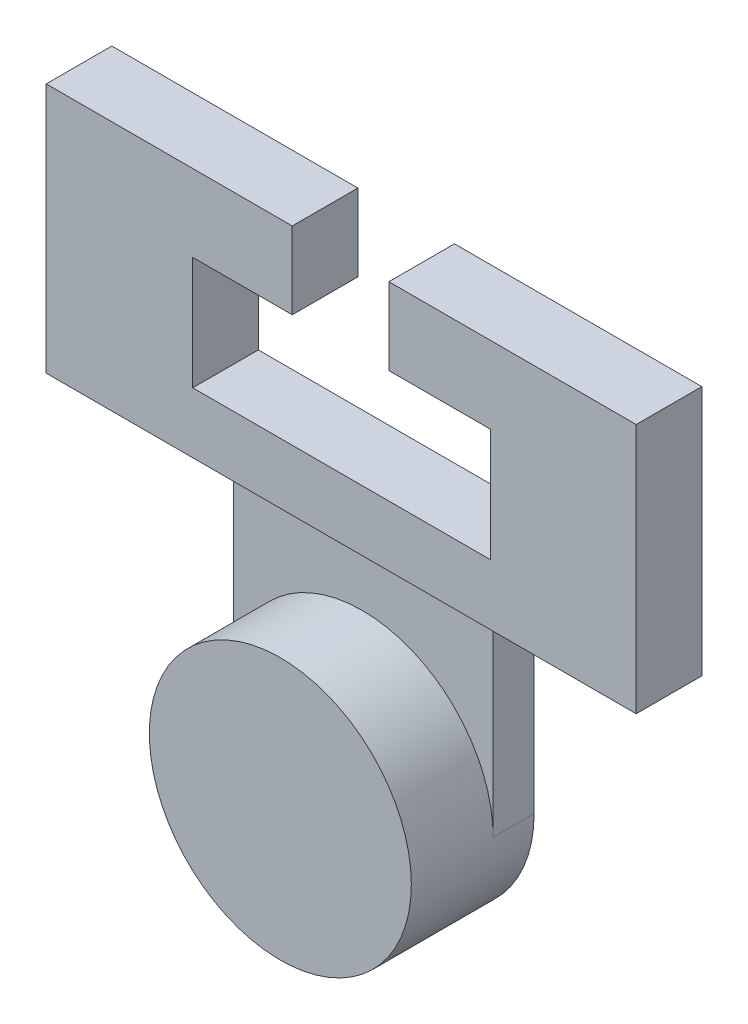
ISO-10303-21;
HEADER;
FILE_DESCRIPTION(('STEP AP214'),'2;1');
FILE_NAME('part.step','',(''),(''),'','','');
FILE_SCHEMA(('AUTOMOTIVE_DESIGN { 1 0 10303 214 1 1 1 1 }'));
ENDSEC;
DATA;
#1=APPLICATION_CONTEXT('core data for automotive mechanical design processes');
#2=APPLICATION_PROTOCOL_DEFINITION('international standard','automotive_design',2000,#1);
#3=PRODUCT_CONTEXT('',#1,'mechanical');
#4=PRODUCT('Part','Part','',(#3));
#5=PRODUCT_RELATED_PRODUCT_CATEGORY('part','',(#4));
#6=PRODUCT_DEFINITION_FORMATION('','',#4);
#7=PRODUCT_DEFINITION_CONTEXT('part definition',#1,'design');
#8=PRODUCT_DEFINITION('design','',#6,#7);
#9=PRODUCT_DEFINITION_SHAPE('','',#8);
#10=(LENGTH_UNIT() NAMED_UNIT(*) SI_UNIT(.MILLI.,.METRE.));
#11=(NAMED_UNIT(*) PLANE_ANGLE_UNIT() SI_UNIT($,.RADIAN.));
#12=(NAMED_UNIT(*) SI_UNIT($,.STERADIAN.) SOLID_ANGLE_UNIT());
#13=UNCERTAINTY_MEASURE_WITH_UNIT(LENGTH_MEASURE(1.E-05),#10,'distance_accuracy_value','');
#14=(GEOMETRIC_REPRESENTATION_CONTEXT(3) GLOBAL_UNCERTAINTY_ASSIGNED_CONTEXT((#13)) GLOBAL_UNIT_ASSIGNED_CONTEXT((#10,
#11,#12)) REPRESENTATION_CONTEXT('',''));
#15=CARTESIAN_POINT('',(0.,0.,0.));
#16=DIRECTION('',(0.,0.,1.));
#17=DIRECTION('',(1.,0.,0.));
#18=AXIS2_PLACEMENT_3D('',#15,#16,#17);
#19=CARTESIAN_POINT('',(0.,0.,-9.525));
#20=DIRECTION('',(0.,0.,1.));
#21=DIRECTION('',(1.,0.,0.));
#22=AXIS2_PLACEMENT_3D('',#19,#20,#21);
#23=CYLINDRICAL_SURFACE('',#22,10.16);
#24=DIRECTION('',(0.,0.,1.));
#25=VECTOR('',#24,1.);
#26=CARTESIAN_POINT('',(-9.99152441464391,1.84256339689434,-9.525));
#27=LINE('',#26,#25);
#28=CARTESIAN_POINT('',(-9.99152441464391,1.84256339689432,-9.525));
#29=VERTEX_POINT('',#28);
#30=CARTESIAN_POINT('',(-9.99152441464391,1.84256339689432,-6.35));
#31=VERTEX_POINT('',#30);
#32=EDGE_CURVE('E268',#29,#31,#27,.T.);
#33=ORIENTED_EDGE('',*,*,#32,.F.);
#34=CARTESIAN_POINT('',(0.,0.,-9.525));
#35=DIRECTION('',(0.,0.,1.));
#36=DIRECTION('',(1.,0.,0.));
#37=AXIS2_PLACEMENT_3D('',#34,#35,#36);
#38=CIRCLE('',#37,10.16);
#39=CARTESIAN_POINT('',(10.16,0.,-9.525));
#40=VERTEX_POINT('',#39);
#41=EDGE_CURVE('E59',#29,#40,#38,.T.);
#42=ORIENTED_EDGE('',*,*,#41,.T.);
#43=DIRECTION('',(0.,0.,-1.));
#44=VECTOR('',#43,1.);
#45=CARTESIAN_POINT('',(10.16,0.,-6.35));
#46=LINE('',#45,#44);
#47=CARTESIAN_POINT('',(10.16,0.,-6.35));
#48=VERTEX_POINT('',#47);
#49=EDGE_CURVE('E258',#48,#40,#46,.T.);
#50=ORIENTED_EDGE('',*,*,#49,.F.);
#51=CARTESIAN_POINT('',(0.,0.,-6.35));
#52=DIRECTION('',(0.,0.,1.));
#53=DIRECTION('',(1.,0.,0.));
#54=AXIS2_PLACEMENT_3D('',#51,#52,#53);
#55=CIRCLE('',#54,10.16);
#56=EDGE_CURVE('E12',#31,#48,#55,.F.);
#57=ORIENTED_EDGE('',*,*,#56,.F.);
#58=EDGE_LOOP('',(#33,#42,#50,#57));
#59=FACE_BOUND('',#58,.T.);
#60=CARTESIAN_POINT('',(0.,0.,0.));
#61=DIRECTION('',(0.,0.,1.));
#62=DIRECTION('',(1.,0.,0.));
#63=AXIS2_PLACEMENT_3D('',#60,#61,#62);
#64=CIRCLE('',#63,10.16);
#65=CARTESIAN_POINT('',(10.16,0.,0.));
#66=VERTEX_POINT('',#65);
#67=EDGE_CURVE('E276',#66,#66,#64,.T.);
#68=ORIENTED_EDGE('',*,*,#67,.F.);
#69=EDGE_LOOP('',(#68));
#70=FACE_BOUND('',#69,.T.);
#71=ADVANCED_FACE('F49',(#59,#70),#23,.T.);
#72=CARTESIAN_POINT('',(0.,0.,-9.525));
#73=DIRECTION('',(0.,0.,1.));
#74=DIRECTION('',(1.,0.,0.));
#75=AXIS2_PLACEMENT_3D('',#72,#73,#74);
#76=PLANE('',#75);
#77=ORIENTED_EDGE('',*,*,#41,.F.);
#78=DIRECTION('',(0.,1.,0.));
#79=VECTOR('',#78,1.);
#80=CARTESIAN_POINT('',(-9.99152441464391,0.,-9.525));
#81=LINE('',#80,#79);
#82=CARTESIAN_POINT('',(-9.99152441464391,15.7544963007669,-9.525));
#83=VERTEX_POINT('',#82);
#84=EDGE_CURVE('E261',#29,#83,#81,.T.);
#85=ORIENTED_EDGE('',*,*,#84,.T.);
#86=DIRECTION('',(-1.,0.,0.));
#87=VECTOR('',#86,1.);
#88=CARTESIAN_POINT('',(-9.99152441464391,15.7544963007669,-9.525));
#89=LINE('',#88,#87);
#90=CARTESIAN_POINT('',(-22.5940298544979,15.7544963007669,-9.525));
#91=VERTEX_POINT('',#90);
#92=EDGE_CURVE('E309',#83,#91,#89,.T.);
#93=ORIENTED_EDGE('',*,*,#92,.T.);
#94=DIRECTION('',(0.,-1.,0.));
#95=VECTOR('',#94,1.);
#96=CARTESIAN_POINT('',(-22.5940298544979,20.4534963007669,-9.525));
#97=LINE('',#96,#95);
#98=CARTESIAN_POINT('',(-22.5940298544979,35.1854963007669,-9.525));
#99=VERTEX_POINT('',#98);
#100=EDGE_CURVE('E172',#99,#91,#97,.T.);
#101=ORIENTED_EDGE('',*,*,#100,.F.);
#102=DIRECTION('',(-1.,0.,0.));
#103=VECTOR('',#102,1.);
#104=CARTESIAN_POINT('',(-22.5940298544979,35.1854963007669,-9.525));
#105=LINE('',#104,#103);
#106=CARTESIAN_POINT('',(-3.51021879319782,35.1854963007669,-9.525));
#107=VERTEX_POINT('',#106);
#108=EDGE_CURVE('E188',#107,#99,#105,.T.);
#109=ORIENTED_EDGE('',*,*,#108,.F.);
#110=DIRECTION('',(0.,-1.,0.));
#111=VECTOR('',#110,1.);
#112=CARTESIAN_POINT('',(-3.51021879319782,35.1854963007669,-9.525));
#113=LINE('',#112,#111);
#114=CARTESIAN_POINT('',(-3.51021879319782,29.2164963007669,-9.525));
#115=VERTEX_POINT('',#114);
#116=EDGE_CURVE('E205',#107,#115,#113,.T.);
#117=ORIENTED_EDGE('',*,*,#116,.T.);
#118=DIRECTION('',(-1.,0.,0.));
#119=VECTOR('',#118,1.);
#120=CARTESIAN_POINT('',(-22.5940298544979,29.2164963007669,-9.525));
#121=LINE('',#120,#119);
#122=CARTESIAN_POINT('',(-11.2292856636925,29.2164963007669,-9.525));
#123=VERTEX_POINT('',#122);
#124=EDGE_CURVE('E192',#115,#123,#121,.T.);
#125=ORIENTED_EDGE('',*,*,#124,.T.);
#126=DIRECTION('',(0.,-1.,0.));
#127=VECTOR('',#126,1.);
#128=CARTESIAN_POINT('',(-11.2292856636925,29.2164963007669,-9.525));
#129=LINE('',#128,#127);
#130=CARTESIAN_POINT('',(-11.2292856636925,20.4534963007669,-9.525));
#131=VERTEX_POINT('',#130);
#132=EDGE_CURVE('E338',#123,#131,#129,.T.);
#133=ORIENTED_EDGE('',*,*,#132,.T.);
#134=DIRECTION('',(-1.,0.,0.));
#135=VECTOR('',#134,1.);
#136=CARTESIAN_POINT('',(23.1661170587528,20.4534963007669,-9.525));
#137=LINE('',#136,#135);
#138=CARTESIAN_POINT('',(11.8519896998851,20.4534963007669,-9.525));
#139=VERTEX_POINT('',#138);
#140=EDGE_CURVE('E299',#139,#131,#137,.T.);
#141=ORIENTED_EDGE('',*,*,#140,.F.);
#142=DIRECTION('',(0.,-1.,0.));
#143=VECTOR('',#142,1.);
#144=CARTESIAN_POINT('',(11.8519896998851,29.2164963007669,-9.525));
#145=LINE('',#144,#143);
#146=CARTESIAN_POINT('',(11.8519896998851,29.2164963007669,-9.525));
#147=VERTEX_POINT('',#146);
#148=EDGE_CURVE('E212',#147,#139,#145,.T.);
#149=ORIENTED_EDGE('',*,*,#148,.F.);
#150=DIRECTION('',(-1.,0.,0.));
#151=VECTOR('',#150,1.);
#152=CARTESIAN_POINT('',(23.1661170587528,29.2164963007669,-9.525));
#153=LINE('',#152,#151);
#154=CARTESIAN_POINT('',(3.98107233357738,29.2164963007669,-9.525));
#155=VERTEX_POINT('',#154);
#156=EDGE_CURVE('E206',#147,#155,#153,.T.);
#157=ORIENTED_EDGE('',*,*,#156,.T.);
#158=DIRECTION('',(0.,-1.,0.));
#159=VECTOR('',#158,1.);
#160=CARTESIAN_POINT('',(3.98107233357738,35.1854963007669,-9.525));
#161=LINE('',#160,#159);
#162=CARTESIAN_POINT('',(3.98107233357738,35.1854963007669,-9.525));
#163=VERTEX_POINT('',#162);
#164=EDGE_CURVE('E214',#163,#155,#161,.T.);
#165=ORIENTED_EDGE('',*,*,#164,.F.);
#166=DIRECTION('',(-1.,0.,0.));
#167=VECTOR('',#166,1.);
#168=CARTESIAN_POINT('',(23.1661170587528,35.1854963007669,-9.525));
#169=LINE('',#168,#167);
#170=CARTESIAN_POINT('',(23.1661170587528,35.1854963007669,-9.525));
#171=VERTEX_POINT('',#170);
#172=EDGE_CURVE('E354',#171,#163,#169,.T.);
#173=ORIENTED_EDGE('',*,*,#172,.F.);
#174=DIRECTION('',(0.,-1.,0.));
#175=VECTOR('',#174,1.);
#176=CARTESIAN_POINT('',(23.1661170587528,20.4534963007669,-9.525));
#177=LINE('',#176,#175);
#178=CARTESIAN_POINT('',(23.1661170587528,15.7544963007669,-9.525));
#179=VERTEX_POINT('',#178);
#180=EDGE_CURVE('E296',#171,#179,#177,.T.);
#181=ORIENTED_EDGE('',*,*,#180,.T.);
#182=CARTESIAN_POINT('',(10.16,15.7544963007669,-9.525));
#183=VERTEX_POINT('',#182);
#184=EDGE_CURVE('E311',#179,#183,#89,.T.);
#185=ORIENTED_EDGE('',*,*,#184,.T.);
#186=DIRECTION('',(0.,-1.,0.));
#187=VECTOR('',#186,1.);
#188=CARTESIAN_POINT('',(10.16,0.,-9.525));
#189=LINE('',#188,#187);
#190=EDGE_CURVE('E260',#183,#40,#189,.T.);
#191=ORIENTED_EDGE('',*,*,#190,.T.);
#192=EDGE_LOOP('',(#77,#85,#93,#101,#109,#117,#125,#133,#141,#149,#157,#165,#173,#181,#185,#191));
#193=FACE_BOUND('',#192,.T.);
#194=ADVANCED_FACE('F382',(#193),#76,.F.);
#195=CARTESIAN_POINT('',(0.,0.,0.));
#196=DIRECTION('',(0.,0.,1.));
#197=DIRECTION('',(1.,0.,0.));
#198=AXIS2_PLACEMENT_3D('',#195,#196,#197);
#199=PLANE('',#198);
#200=ORIENTED_EDGE('',*,*,#67,.T.);
#201=EDGE_LOOP('',(#200));
#202=FACE_BOUND('',#201,.T.);
#203=ADVANCED_FACE('F384',(#202),#199,.T.);
#204=CARTESIAN_POINT('',(10.16,0.,-6.35));
#205=DIRECTION('',(1.,0.,0.));
#206=DIRECTION('',(0.,0.,-1.));
#207=AXIS2_PLACEMENT_3D('',#204,#205,#206);
#208=PLANE('',#207);
#209=ORIENTED_EDGE('',*,*,#190,.F.);
#210=DIRECTION('',(0.,0.,-1.));
#211=VECTOR('',#210,1.);
#212=CARTESIAN_POINT('',(10.16,15.7544963007669,-6.35));
#213=LINE('',#212,#211);
#214=CARTESIAN_POINT('',(10.16,15.7544963007669,-6.35));
#215=VERTEX_POINT('',#214);
#216=EDGE_CURVE('E262',#215,#183,#213,.T.);
#217=ORIENTED_EDGE('',*,*,#216,.F.);
#218=DIRECTION('',(0.,-1.,0.));
#219=VECTOR('',#218,1.);
#220=CARTESIAN_POINT('',(10.16,0.,-6.35));
#221=LINE('',#220,#219);
#222=EDGE_CURVE('E246',#215,#48,#221,.T.);
#223=ORIENTED_EDGE('',*,*,#222,.T.);
#224=ORIENTED_EDGE('',*,*,#49,.T.);
#225=EDGE_LOOP('',(#209,#217,#223,#224));
#226=FACE_BOUND('',#225,.T.);
#227=ADVANCED_FACE('F375',(#226),#208,.T.);
#228=CARTESIAN_POINT('',(-9.99152441464391,0.,-6.35));
#229=DIRECTION('',(-1.,0.,0.));
#230=DIRECTION('',(0.,0.,1.));
#231=AXIS2_PLACEMENT_3D('',#228,#229,#230);
#232=PLANE('',#231);
#233=ORIENTED_EDGE('',*,*,#84,.F.);
#234=ORIENTED_EDGE('',*,*,#32,.T.);
#235=DIRECTION('',(0.,1.,0.));
#236=VECTOR('',#235,1.);
#237=CARTESIAN_POINT('',(-9.99152441464391,0.,-6.35));
#238=LINE('',#237,#236);
#239=CARTESIAN_POINT('',(-9.99152441464391,15.7544963007669,-6.35));
#240=VERTEX_POINT('',#239);
#241=EDGE_CURVE('E243',#31,#240,#238,.T.);
#242=ORIENTED_EDGE('',*,*,#241,.T.);
#243=DIRECTION('',(0.,0.,-1.));
#244=VECTOR('',#243,1.);
#245=CARTESIAN_POINT('',(-9.99152441464391,15.7544963007669,-6.35));
#246=LINE('',#245,#244);
#247=EDGE_CURVE('E267',#240,#83,#246,.T.);
#248=ORIENTED_EDGE('',*,*,#247,.T.);
#249=EDGE_LOOP('',(#233,#234,#242,#248));
#250=FACE_BOUND('',#249,.T.);
#251=ADVANCED_FACE('F385',(#250),#232,.T.);
#252=CARTESIAN_POINT('',(0.,0.,-6.35));
#253=DIRECTION('',(0.,0.,1.));
#254=DIRECTION('',(1.,0.,0.));
#255=AXIS2_PLACEMENT_3D('',#252,#253,#254);
#256=PLANE('',#255);
#257=ORIENTED_EDGE('',*,*,#241,.F.);
#258=ORIENTED_EDGE('',*,*,#56,.T.);
#259=ORIENTED_EDGE('',*,*,#222,.F.);
#260=DIRECTION('',(1.,0.,0.));
#261=VECTOR('',#260,1.);
#262=CARTESIAN_POINT('',(10.16,15.7544963007669,-6.35));
#263=LINE('',#262,#261);
#264=EDGE_CURVE('E249',#240,#215,#263,.T.);
#265=ORIENTED_EDGE('',*,*,#264,.F.);
#266=EDGE_LOOP('',(#257,#258,#259,#265));
#267=FACE_BOUND('',#266,.T.);
#268=ADVANCED_FACE('F374',(#267),#256,.T.);
#269=CARTESIAN_POINT('',(-22.5940298544979,20.4534963007669,-9.525));
#270=DIRECTION('',(1.,0.,0.));
#271=DIRECTION('',(0.,0.,-1.));
#272=AXIS2_PLACEMENT_3D('',#269,#270,#271);
#273=PLANE('',#272);
#274=DIRECTION('',(0.,0.,1.));
#275=VECTOR('',#274,1.);
#276=CARTESIAN_POINT('',(-22.5940298544979,15.7544963007669,-9.525));
#277=LINE('',#276,#275);
#278=CARTESIAN_POINT('',(-22.5940298544979,15.7544963007669,-4.4350592362056));
#279=VERTEX_POINT('',#278);
#280=EDGE_CURVE('E166',#91,#279,#277,.T.);
#281=ORIENTED_EDGE('',*,*,#280,.T.);
#282=DIRECTION('',(0.,-1.,0.));
#283=VECTOR('',#282,1.);
#284=CARTESIAN_POINT('',(-22.5940298544979,20.4534963007669,-4.4350592362056));
#285=LINE('',#284,#283);
#286=CARTESIAN_POINT('',(-22.5940298544979,35.1854963007669,-4.4350592362056));
#287=VERTEX_POINT('',#286);
#288=EDGE_CURVE('E165',#287,#279,#285,.T.);
#289=ORIENTED_EDGE('',*,*,#288,.F.);
#290=DIRECTION('',(0.,0.,1.));
#291=VECTOR('',#290,1.);
#292=CARTESIAN_POINT('',(-22.5940298544979,35.1854963007669,-9.525));
#293=LINE('',#292,#291);
#294=EDGE_CURVE('E170',#99,#287,#293,.T.);
#295=ORIENTED_EDGE('',*,*,#294,.F.);
#296=ORIENTED_EDGE('',*,*,#100,.T.);
#297=EDGE_LOOP('',(#281,#289,#295,#296));
#298=FACE_BOUND('',#297,.T.);
#299=ADVANCED_FACE('F163',(#298),#273,.F.);
#300=CARTESIAN_POINT('',(-22.5940298544979,20.4534963007669,-4.4350592362056));
#301=DIRECTION('',(0.,0.,-1.));
#302=DIRECTION('',(-1.,0.,0.));
#303=AXIS2_PLACEMENT_3D('',#300,#301,#302);
#304=PLANE('',#303);
#305=DIRECTION('',(1.,0.,0.));
#306=VECTOR('',#305,1.);
#307=CARTESIAN_POINT('',(-22.5940298544979,15.7544963007669,-4.4350592362056));
#308=LINE('',#307,#306);
#309=CARTESIAN_POINT('',(23.1661170587528,15.7544963007669,-4.4350592362056));
#310=VERTEX_POINT('',#309);
#311=EDGE_CURVE('E286',#279,#310,#308,.T.);
#312=ORIENTED_EDGE('',*,*,#311,.T.);
#313=DIRECTION('',(0.,-1.,0.));
#314=VECTOR('',#313,1.);
#315=CARTESIAN_POINT('',(23.1661170587528,20.4534963007669,-4.4350592362056));
#316=LINE('',#315,#314);
#317=CARTESIAN_POINT('',(23.1661170587528,35.1854963007669,-4.4350592362056));
#318=VERTEX_POINT('',#317);
#319=EDGE_CURVE('E173',#318,#310,#316,.T.);
#320=ORIENTED_EDGE('',*,*,#319,.F.);
#321=DIRECTION('',(1.,0.,0.));
#322=VECTOR('',#321,1.);
#323=CARTESIAN_POINT('',(23.1661170587528,35.1854963007669,-4.4350592362056));
#324=LINE('',#323,#322);
#325=CARTESIAN_POINT('',(3.98107233357738,35.1854963007669,-4.4350592362056));
#326=VERTEX_POINT('',#325);
#327=EDGE_CURVE('E224',#326,#318,#324,.T.);
#328=ORIENTED_EDGE('',*,*,#327,.F.);
#329=DIRECTION('',(0.,-1.,0.));
#330=VECTOR('',#329,1.);
#331=CARTESIAN_POINT('',(3.98107233357738,35.1854963007669,-4.4350592362056));
#332=LINE('',#331,#330);
#333=CARTESIAN_POINT('',(3.98107233357738,29.2164963007669,-4.4350592362056));
#334=VERTEX_POINT('',#333);
#335=EDGE_CURVE('E218',#326,#334,#332,.T.);
#336=ORIENTED_EDGE('',*,*,#335,.T.);
#337=DIRECTION('',(1.,0.,0.));
#338=VECTOR('',#337,1.);
#339=CARTESIAN_POINT('',(23.1661170587528,29.2164963007669,-4.4350592362056));
#340=LINE('',#339,#338);
#341=CARTESIAN_POINT('',(11.8519896998851,29.2164963007669,-4.4350592362056));
#342=VERTEX_POINT('',#341);
#343=EDGE_CURVE('E221',#334,#342,#340,.T.);
#344=ORIENTED_EDGE('',*,*,#343,.T.);
#345=DIRECTION('',(0.,-1.,0.));
#346=VECTOR('',#345,1.);
#347=CARTESIAN_POINT('',(11.8519896998851,29.2164963007669,-4.4350592362056));
#348=LINE('',#347,#346);
#349=CARTESIAN_POINT('',(11.8519896998851,20.4534963007669,-4.4350592362056));
#350=VERTEX_POINT('',#349);
#351=EDGE_CURVE('E330',#342,#350,#348,.T.);
#352=ORIENTED_EDGE('',*,*,#351,.T.);
#353=DIRECTION('',(1.,0.,0.));
#354=VECTOR('',#353,1.);
#355=CARTESIAN_POINT('',(-22.5940298544979,20.4534963007669,-4.4350592362056));
#356=LINE('',#355,#354);
#357=CARTESIAN_POINT('',(-11.2292856636925,20.4534963007669,-4.4350592362056));
#358=VERTEX_POINT('',#357);
#359=EDGE_CURVE('E302',#358,#350,#356,.T.);
#360=ORIENTED_EDGE('',*,*,#359,.F.);
#361=DIRECTION('',(0.,-1.,0.));
#362=VECTOR('',#361,1.);
#363=CARTESIAN_POINT('',(-11.2292856636925,29.2164963007669,-4.4350592362056));
#364=LINE('',#363,#362);
#365=CARTESIAN_POINT('',(-11.2292856636925,29.2164963007669,-4.4350592362056));
#366=VERTEX_POINT('',#365);
#367=EDGE_CURVE('E320',#366,#358,#364,.T.);
#368=ORIENTED_EDGE('',*,*,#367,.F.);
#369=DIRECTION('',(1.,0.,0.));
#370=VECTOR('',#369,1.);
#371=CARTESIAN_POINT('',(-22.5940298544979,29.2164963007669,-4.4350592362056));
#372=LINE('',#371,#370);
#373=CARTESIAN_POINT('',(-3.51021879319782,29.2164963007669,-4.4350592362056));
#374=VERTEX_POINT('',#373);
#375=EDGE_CURVE('E201',#366,#374,#372,.T.);
#376=ORIENTED_EDGE('',*,*,#375,.T.);
#377=DIRECTION('',(0.,-1.,0.));
#378=VECTOR('',#377,1.);
#379=CARTESIAN_POINT('',(-3.51021879319782,35.1854963007669,-4.4350592362056));
#380=LINE('',#379,#378);
#381=CARTESIAN_POINT('',(-3.51021879319782,35.1854963007669,-4.4350592362056));
#382=VERTEX_POINT('',#381);
#383=EDGE_CURVE('E179',#382,#374,#380,.T.);
#384=ORIENTED_EDGE('',*,*,#383,.F.);
#385=DIRECTION('',(1.,0.,0.));
#386=VECTOR('',#385,1.);
#387=CARTESIAN_POINT('',(-22.5940298544979,35.1854963007669,-4.4350592362056));
#388=LINE('',#387,#386);
#389=EDGE_CURVE('E180',#287,#382,#388,.T.);
#390=ORIENTED_EDGE('',*,*,#389,.F.);
#391=ORIENTED_EDGE('',*,*,#288,.T.);
#392=EDGE_LOOP('',(#312,#320,#328,#336,#344,#352,#360,#368,#376,#384,#390,#391));
#393=FACE_BOUND('',#392,.T.);
#394=ADVANCED_FACE('F178',(#393),#304,.F.);
#395=CARTESIAN_POINT('',(23.1661170587528,20.4534963007669,-4.4350592362056));
#396=DIRECTION('',(-1.,0.,0.));
#397=DIRECTION('',(0.,0.,1.));
#398=AXIS2_PLACEMENT_3D('',#395,#396,#397);
#399=PLANE('',#398);
#400=DIRECTION('',(0.,0.,-1.));
#401=VECTOR('',#400,1.);
#402=CARTESIAN_POINT('',(23.1661170587528,15.7544963007669,-4.4350592362056));
#403=LINE('',#402,#401);
#404=EDGE_CURVE('E292',#310,#179,#403,.T.);
#405=ORIENTED_EDGE('',*,*,#404,.T.);
#406=ORIENTED_EDGE('',*,*,#180,.F.);
#407=DIRECTION('',(0.,0.,-1.));
#408=VECTOR('',#407,1.);
#409=CARTESIAN_POINT('',(23.1661170587528,35.1854963007669,-9.525));
#410=LINE('',#409,#408);
#411=EDGE_CURVE('E228',#318,#171,#410,.T.);
#412=ORIENTED_EDGE('',*,*,#411,.F.);
#413=ORIENTED_EDGE('',*,*,#319,.T.);
#414=EDGE_LOOP('',(#405,#406,#412,#413));
#415=FACE_BOUND('',#414,.T.);
#416=ADVANCED_FACE('F370',(#415),#399,.F.);
#417=CARTESIAN_POINT('',(0.,20.4534963007669,0.));
#418=DIRECTION('',(0.,1.,0.));
#419=DIRECTION('',(0.,0.,1.));
#420=AXIS2_PLACEMENT_3D('',#417,#418,#419);
#421=PLANE('',#420);
#422=DIRECTION('',(0.,0.,-1.));
#423=VECTOR('',#422,1.);
#424=CARTESIAN_POINT('',(-11.2292856636925,20.4534963007669,-9.525));
#425=LINE('',#424,#423);
#426=EDGE_CURVE('E64',#358,#131,#425,.T.);
#427=ORIENTED_EDGE('',*,*,#426,.F.);
#428=ORIENTED_EDGE('',*,*,#359,.T.);
#429=DIRECTION('',(0.,0.,1.));
#430=VECTOR('',#429,1.);
#431=CARTESIAN_POINT('',(11.8519896998851,20.4534963007669,-9.525));
#432=LINE('',#431,#430);
#433=EDGE_CURVE('E69',#139,#350,#432,.T.);
#434=ORIENTED_EDGE('',*,*,#433,.F.);
#435=ORIENTED_EDGE('',*,*,#140,.T.);
#436=EDGE_LOOP('',(#427,#428,#434,#435));
#437=FACE_BOUND('',#436,.T.);
#438=ADVANCED_FACE('F409',(#437),#421,.T.);
#439=CARTESIAN_POINT('',(0.,15.7544963007669,0.));
#440=DIRECTION('',(0.,1.,0.));
#441=DIRECTION('',(0.,0.,1.));
#442=AXIS2_PLACEMENT_3D('',#439,#440,#441);
#443=PLANE('',#442);
#444=ORIENTED_EDGE('',*,*,#247,.F.);
#445=ORIENTED_EDGE('',*,*,#264,.T.);
#446=ORIENTED_EDGE('',*,*,#216,.T.);
#447=ORIENTED_EDGE('',*,*,#184,.F.);
#448=ORIENTED_EDGE('',*,*,#404,.F.);
#449=ORIENTED_EDGE('',*,*,#311,.F.);
#450=ORIENTED_EDGE('',*,*,#280,.F.);
#451=ORIENTED_EDGE('',*,*,#92,.F.);
#452=EDGE_LOOP('',(#444,#445,#446,#447,#448,#449,#450,#451));
#453=FACE_BOUND('',#452,.T.);
#454=ADVANCED_FACE('F310',(#453),#443,.F.);
#455=CARTESIAN_POINT('',(11.8519896998851,29.2164963007669,-9.525));
#456=DIRECTION('',(1.,0.,0.));
#457=DIRECTION('',(0.,0.,-1.));
#458=AXIS2_PLACEMENT_3D('',#455,#456,#457);
#459=PLANE('',#458);
#460=ORIENTED_EDGE('',*,*,#433,.T.);
#461=ORIENTED_EDGE('',*,*,#351,.F.);
#462=DIRECTION('',(0.,0.,1.));
#463=VECTOR('',#462,1.);
#464=CARTESIAN_POINT('',(11.8519896998851,29.2164963007669,-9.525));
#465=LINE('',#464,#463);
#466=EDGE_CURVE('E323',#147,#342,#465,.T.);
#467=ORIENTED_EDGE('',*,*,#466,.F.);
#468=ORIENTED_EDGE('',*,*,#148,.T.);
#469=EDGE_LOOP('',(#460,#461,#467,#468));
#470=FACE_BOUND('',#469,.T.);
#471=ADVANCED_FACE('F408',(#470),#459,.F.);
#472=CARTESIAN_POINT('',(-11.2292856636925,29.2164963007669,-9.525));
#473=DIRECTION('',(-1.,0.,0.));
#474=DIRECTION('',(0.,0.,1.));
#475=AXIS2_PLACEMENT_3D('',#472,#473,#474);
#476=PLANE('',#475);
#477=ORIENTED_EDGE('',*,*,#426,.T.);
#478=ORIENTED_EDGE('',*,*,#132,.F.);
#479=DIRECTION('',(0.,0.,-1.));
#480=VECTOR('',#479,1.);
#481=CARTESIAN_POINT('',(-11.2292856636925,29.2164963007669,-9.525));
#482=LINE('',#481,#480);
#483=EDGE_CURVE('E343',#366,#123,#482,.T.);
#484=ORIENTED_EDGE('',*,*,#483,.F.);
#485=ORIENTED_EDGE('',*,*,#367,.T.);
#486=EDGE_LOOP('',(#477,#478,#484,#485));
#487=FACE_BOUND('',#486,.T.);
#488=ADVANCED_FACE('F413',(#487),#476,.F.);
#489=CARTESIAN_POINT('',(0.,29.2164963007669,0.));
#490=DIRECTION('',(0.,1.,0.));
#491=DIRECTION('',(0.,0.,1.));
#492=AXIS2_PLACEMENT_3D('',#489,#490,#491);
#493=PLANE('',#492);
#494=ORIENTED_EDGE('',*,*,#375,.F.);
#495=ORIENTED_EDGE('',*,*,#483,.T.);
#496=ORIENTED_EDGE('',*,*,#124,.F.);
#497=DIRECTION('',(0.,0.,-1.));
#498=VECTOR('',#497,1.);
#499=CARTESIAN_POINT('',(-3.51021879319782,29.2164963007669,-9.525));
#500=LINE('',#499,#498);
#501=EDGE_CURVE('E191',#374,#115,#500,.T.);
#502=ORIENTED_EDGE('',*,*,#501,.F.);
#503=EDGE_LOOP('',(#494,#495,#496,#502));
#504=FACE_BOUND('',#503,.T.);
#505=ADVANCED_FACE('F417',(#504),#493,.F.);
#506=CARTESIAN_POINT('',(-3.51021879319782,35.1854963007669,-9.525));
#507=DIRECTION('',(-1.,0.,0.));
#508=DIRECTION('',(0.,0.,1.));
#509=AXIS2_PLACEMENT_3D('',#506,#507,#508);
#510=PLANE('',#509);
#511=ORIENTED_EDGE('',*,*,#501,.T.);
#512=ORIENTED_EDGE('',*,*,#116,.F.);
#513=DIRECTION('',(0.,0.,-1.));
#514=VECTOR('',#513,1.);
#515=CARTESIAN_POINT('',(-3.51021879319782,35.1854963007669,-9.525));
#516=LINE('',#515,#514);
#517=EDGE_CURVE('E184',#382,#107,#516,.T.);
#518=ORIENTED_EDGE('',*,*,#517,.F.);
#519=ORIENTED_EDGE('',*,*,#383,.T.);
#520=EDGE_LOOP('',(#511,#512,#518,#519));
#521=FACE_BOUND('',#520,.T.);
#522=ADVANCED_FACE('F430',(#521),#510,.F.);
#523=CARTESIAN_POINT('',(0.,35.1854963007669,0.));
#524=DIRECTION('',(0.,1.,0.));
#525=DIRECTION('',(0.,0.,1.));
#526=AXIS2_PLACEMENT_3D('',#523,#524,#525);
#527=PLANE('',#526);
#528=ORIENTED_EDGE('',*,*,#294,.T.);
#529=ORIENTED_EDGE('',*,*,#389,.T.);
#530=ORIENTED_EDGE('',*,*,#517,.T.);
#531=ORIENTED_EDGE('',*,*,#108,.T.);
#532=EDGE_LOOP('',(#528,#529,#530,#531));
#533=FACE_BOUND('',#532,.T.);
#534=ADVANCED_FACE('F186',(#533),#527,.T.);
#535=CARTESIAN_POINT('',(3.98107233357738,35.1854963007669,-9.525));
#536=DIRECTION('',(1.,0.,0.));
#537=DIRECTION('',(0.,0.,-1.));
#538=AXIS2_PLACEMENT_3D('',#535,#536,#537);
#539=PLANE('',#538);
#540=DIRECTION('',(0.,0.,1.));
#541=VECTOR('',#540,1.);
#542=CARTESIAN_POINT('',(3.98107233357738,29.2164963007669,-9.525));
#543=LINE('',#542,#541);
#544=EDGE_CURVE('E227',#155,#334,#543,.T.);
#545=ORIENTED_EDGE('',*,*,#544,.T.);
#546=ORIENTED_EDGE('',*,*,#335,.F.);
#547=DIRECTION('',(0.,0.,1.));
#548=VECTOR('',#547,1.);
#549=CARTESIAN_POINT('',(3.98107233357738,35.1854963007669,-9.525));
#550=LINE('',#549,#548);
#551=EDGE_CURVE('E236',#163,#326,#550,.T.);
#552=ORIENTED_EDGE('',*,*,#551,.F.);
#553=ORIENTED_EDGE('',*,*,#164,.T.);
#554=EDGE_LOOP('',(#545,#546,#552,#553));
#555=FACE_BOUND('',#554,.T.);
#556=ADVANCED_FACE('F361',(#555),#539,.F.);
#557=CARTESIAN_POINT('',(0.,35.1854963007669,0.));
#558=DIRECTION('',(0.,-1.,0.));
#559=DIRECTION('',(0.,0.,-1.));
#560=AXIS2_PLACEMENT_3D('',#557,#558,#559);
#561=PLANE('',#560);
#562=ORIENTED_EDGE('',*,*,#411,.T.);
#563=ORIENTED_EDGE('',*,*,#172,.T.);
#564=ORIENTED_EDGE('',*,*,#551,.T.);
#565=ORIENTED_EDGE('',*,*,#327,.T.);
#566=EDGE_LOOP('',(#562,#563,#564,#565));
#567=FACE_BOUND('',#566,.T.);
#568=ADVANCED_FACE('F359',(#567),#561,.F.);
#569=CARTESIAN_POINT('',(0.,29.2164963007669,0.));
#570=DIRECTION('',(0.,-1.,0.));
#571=DIRECTION('',(0.,0.,-1.));
#572=AXIS2_PLACEMENT_3D('',#569,#570,#571);
#573=PLANE('',#572);
#574=ORIENTED_EDGE('',*,*,#156,.F.);
#575=ORIENTED_EDGE('',*,*,#466,.T.);
#576=ORIENTED_EDGE('',*,*,#343,.F.);
#577=ORIENTED_EDGE('',*,*,#544,.F.);
#578=EDGE_LOOP('',(#574,#575,#576,#577));
#579=FACE_BOUND('',#578,.T.);
#580=ADVANCED_FACE('F423',(#579),#573,.T.);
#581=CLOSED_SHELL('',(#71,#194,#203,#227,#251,#268,#299,#394,#416,#438,#454,#471,#488,#505,#522,
#534,#556,#568,#580));
#582=MANIFOLD_SOLID_BREP('B2',#581);
#583=ADVANCED_BREP_SHAPE_REPRESENTATION('',(#18,#582),#14);
#584=SHAPE_DEFINITION_REPRESENTATION(#9,#583);
ENDSEC;
END-ISO-10303-21;
